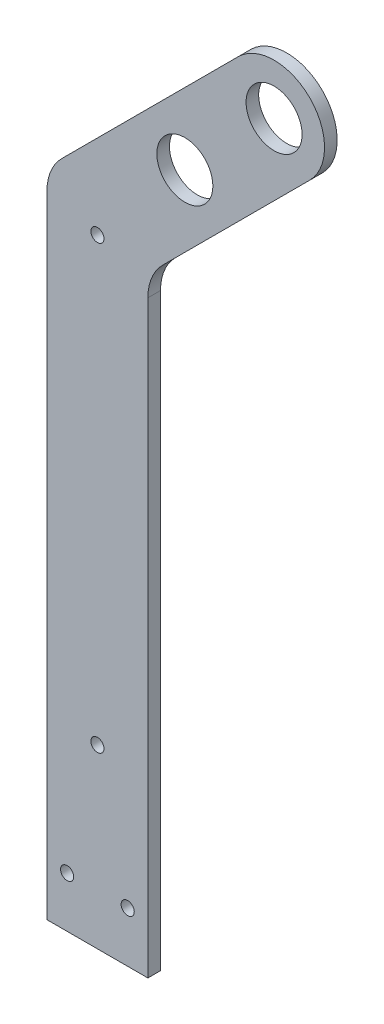
ISO-10303-21;
HEADER;
FILE_DESCRIPTION(('STEP AP214'),'2;1');
FILE_NAME('part.step','',(''),(''),'','','');
FILE_SCHEMA(('AUTOMOTIVE_DESIGN { 1 0 10303 214 1 1 1 1 }'));
ENDSEC;
DATA;
#1=APPLICATION_CONTEXT('core data for automotive mechanical design processes');
#2=APPLICATION_PROTOCOL_DEFINITION('international standard','automotive_design',2000,#1);
#3=PRODUCT_CONTEXT('',#1,'mechanical');
#4=PRODUCT('Part','Part','',(#3));
#5=PRODUCT_RELATED_PRODUCT_CATEGORY('part','',(#4));
#6=PRODUCT_DEFINITION_FORMATION('','',#4);
#7=PRODUCT_DEFINITION_CONTEXT('part definition',#1,'design');
#8=PRODUCT_DEFINITION('design','',#6,#7);
#9=PRODUCT_DEFINITION_SHAPE('','',#8);
#10=(LENGTH_UNIT() NAMED_UNIT(*) SI_UNIT(.MILLI.,.METRE.));
#11=(NAMED_UNIT(*) PLANE_ANGLE_UNIT() SI_UNIT($,.RADIAN.));
#12=(NAMED_UNIT(*) SI_UNIT($,.STERADIAN.) SOLID_ANGLE_UNIT());
#13=UNCERTAINTY_MEASURE_WITH_UNIT(LENGTH_MEASURE(1.E-05),#10,'distance_accuracy_value','');
#14=(GEOMETRIC_REPRESENTATION_CONTEXT(3) GLOBAL_UNCERTAINTY_ASSIGNED_CONTEXT((#13)) GLOBAL_UNIT_ASSIGNED_CONTEXT((#10,
#11,#12)) REPRESENTATION_CONTEXT('',''));
#15=CARTESIAN_POINT('',(0.,0.,0.));
#16=DIRECTION('',(0.,0.,1.));
#17=DIRECTION('',(1.,0.,0.));
#18=AXIS2_PLACEMENT_3D('',#15,#16,#17);
#19=CARTESIAN_POINT('',(-89.9999999999992,-320.,60.));
#20=DIRECTION('',(0.,1.,0.));
#21=DIRECTION('',(0.,0.,1.));
#22=AXIS2_PLACEMENT_3D('',#19,#20,#21);
#23=PLANE('',#22);
#24=DIRECTION('',(1.,0.,0.));
#25=VECTOR('',#24,1.);
#26=CARTESIAN_POINT('',(-89.9999999999992,-320.,5.));
#27=LINE('',#26,#25);
#28=CARTESIAN_POINT('',(-89.9999999999992,-320.,5.));
#29=VERTEX_POINT('',#28);
#30=CARTESIAN_POINT('',(-49.9999999999992,-320.,5.));
#31=VERTEX_POINT('',#30);
#32=EDGE_CURVE('E119',#29,#31,#27,.T.);
#33=ORIENTED_EDGE('',*,*,#32,.F.);
#34=DIRECTION('',(0.,0.,-1.));
#35=VECTOR('',#34,1.);
#36=CARTESIAN_POINT('',(-89.9999999999992,-320.,60.));
#37=LINE('',#36,#35);
#38=CARTESIAN_POINT('',(-89.9999999999992,-320.,0.));
#39=VERTEX_POINT('',#38);
#40=EDGE_CURVE('E130',#29,#39,#37,.T.);
#41=ORIENTED_EDGE('',*,*,#40,.T.);
#42=DIRECTION('',(1.,0.,0.));
#43=VECTOR('',#42,1.);
#44=CARTESIAN_POINT('',(-89.9999999999992,-320.,0.));
#45=LINE('',#44,#43);
#46=CARTESIAN_POINT('',(-49.9999999999992,-320.,0.));
#47=VERTEX_POINT('',#46);
#48=EDGE_CURVE('E221',#39,#47,#45,.T.);
#49=ORIENTED_EDGE('',*,*,#48,.T.);
#50=DIRECTION('',(0.,0.,-1.));
#51=VECTOR('',#50,1.);
#52=CARTESIAN_POINT('',(-49.9999999999992,-320.,60.));
#53=LINE('',#52,#51);
#54=EDGE_CURVE('E132',#31,#47,#53,.T.);
#55=ORIENTED_EDGE('',*,*,#54,.F.);
#56=EDGE_LOOP('',(#33,#41,#49,#55));
#57=FACE_BOUND('',#56,.T.);
#58=ADVANCED_FACE('F49',(#57),#23,.F.);
#59=CARTESIAN_POINT('',(-69.9999999999992,-70.,60.));
#60=DIRECTION('',(0.,0.,-1.));
#61=DIRECTION('',(-1.,0.,0.));
#62=AXIS2_PLACEMENT_3D('',#59,#60,#61);
#63=CYLINDRICAL_SURFACE('',#62,20.);
#64=DIRECTION('',(0.,0.,-1.));
#65=VECTOR('',#64,1.);
#66=CARTESIAN_POINT('',(-89.9999999999992,-70.,60.));
#67=LINE('',#66,#65);
#68=CARTESIAN_POINT('',(-89.9999999999992,-70.,5.));
#69=VERTEX_POINT('',#68);
#70=CARTESIAN_POINT('',(-89.9999999999992,-70.,0.));
#71=VERTEX_POINT('',#70);
#72=EDGE_CURVE('E154',#69,#71,#67,.T.);
#73=ORIENTED_EDGE('',*,*,#72,.F.);
#74=CARTESIAN_POINT('',(-69.9999999999992,-70.,5.));
#75=DIRECTION('',(0.,0.,1.));
#76=DIRECTION('',(1.,0.,0.));
#77=AXIS2_PLACEMENT_3D('',#74,#75,#76);
#78=CIRCLE('',#77,20.);
#79=CARTESIAN_POINT('',(-84.1421356237303,-55.8578643762691,5.));
#80=VERTEX_POINT('',#79);
#81=EDGE_CURVE('E121',#69,#80,#78,.F.);
#82=ORIENTED_EDGE('',*,*,#81,.T.);
#83=DIRECTION('',(0.,0.,-1.));
#84=VECTOR('',#83,1.);
#85=CARTESIAN_POINT('',(-84.1421356237303,-55.8578643762691,60.));
#86=LINE('',#85,#84);
#87=CARTESIAN_POINT('',(-84.1421356237303,-55.8578643762691,0.));
#88=VERTEX_POINT('',#87);
#89=EDGE_CURVE('E163',#88,#80,#86,.F.);
#90=ORIENTED_EDGE('',*,*,#89,.F.);
#91=CARTESIAN_POINT('',(-69.9999999999992,-70.,0.));
#92=DIRECTION('',(0.,0.,1.));
#93=DIRECTION('',(1.,0.,0.));
#94=AXIS2_PLACEMENT_3D('',#91,#92,#93);
#95=CIRCLE('',#94,20.);
#96=EDGE_CURVE('E161',#71,#88,#95,.F.);
#97=ORIENTED_EDGE('',*,*,#96,.F.);
#98=EDGE_LOOP('',(#73,#82,#90,#97));
#99=FACE_BOUND('',#98,.T.);
#100=ADVANCED_FACE('F248',(#99),#63,.T.);
#101=CARTESIAN_POINT('',(-35.3553390593274,-35.3553390593274,-40.));
#102=DIRECTION('',(0.,0.,1.));
#103=DIRECTION('',(1.,0.,0.));
#104=AXIS2_PLACEMENT_3D('',#101,#102,#103);
#105=CYLINDRICAL_SURFACE('',#104,11.1);
#106=CARTESIAN_POINT('',(-35.3553390593274,-35.3553390593274,0.));
#107=DIRECTION('',(0.,0.,1.));
#108=DIRECTION('',(1.,0.,0.));
#109=AXIS2_PLACEMENT_3D('',#106,#107,#108);
#110=CIRCLE('',#109,11.1);
#111=CARTESIAN_POINT('',(-24.2553390593274,-35.3553390593274,0.));
#112=VERTEX_POINT('',#111);
#113=EDGE_CURVE('E155',#112,#112,#110,.T.);
#114=ORIENTED_EDGE('',*,*,#113,.F.);
#115=EDGE_LOOP('',(#114));
#116=FACE_BOUND('',#115,.T.);
#117=CARTESIAN_POINT('',(-35.3553390593274,-35.3553390593274,5.));
#118=DIRECTION('',(0.,0.,1.));
#119=DIRECTION('',(1.,0.,0.));
#120=AXIS2_PLACEMENT_3D('',#117,#118,#119);
#121=CIRCLE('',#120,11.1);
#122=CARTESIAN_POINT('',(-24.2553390593274,-35.3553390593274,5.));
#123=VERTEX_POINT('',#122);
#124=EDGE_CURVE('E133',#123,#123,#121,.F.);
#125=ORIENTED_EDGE('',*,*,#124,.F.);
#126=EDGE_LOOP('',(#125));
#127=FACE_BOUND('',#126,.T.);
#128=ADVANCED_FACE('F253',(#116,#127),#105,.F.);
#129=CARTESIAN_POINT('',(-69.9999999999992,-250.,-5.));
#130=DIRECTION('',(0.,0.,1.));
#131=DIRECTION('',(1.,0.,0.));
#132=AXIS2_PLACEMENT_3D('',#129,#130,#131);
#133=CYLINDRICAL_SURFACE('',#132,2.6);
#134=CARTESIAN_POINT('',(-69.9999999999992,-250.,0.));
#135=DIRECTION('',(0.,0.,1.));
#136=DIRECTION('',(1.,0.,0.));
#137=AXIS2_PLACEMENT_3D('',#134,#135,#136);
#138=CIRCLE('',#137,2.6);
#139=CARTESIAN_POINT('',(-67.3999999999992,-250.,0.));
#140=VERTEX_POINT('',#139);
#141=EDGE_CURVE('E169',#140,#140,#138,.T.);
#142=ORIENTED_EDGE('',*,*,#141,.F.);
#143=EDGE_LOOP('',(#142));
#144=FACE_BOUND('',#143,.T.);
#145=CARTESIAN_POINT('',(-69.9999999999992,-250.,5.));
#146=DIRECTION('',(0.,0.,1.));
#147=DIRECTION('',(1.,0.,0.));
#148=AXIS2_PLACEMENT_3D('',#145,#146,#147);
#149=CIRCLE('',#148,2.6);
#150=CARTESIAN_POINT('',(-67.3999999999992,-250.,5.));
#151=VERTEX_POINT('',#150);
#152=EDGE_CURVE('E186',#151,#151,#149,.F.);
#153=ORIENTED_EDGE('',*,*,#152,.F.);
#154=EDGE_LOOP('',(#153));
#155=FACE_BOUND('',#154,.T.);
#156=ADVANCED_FACE('F181',(#144,#155),#133,.F.);
#157=CARTESIAN_POINT('',(-69.9999999999992,-75.,-5.));
#158=DIRECTION('',(0.,0.,1.));
#159=DIRECTION('',(1.,0.,0.));
#160=AXIS2_PLACEMENT_3D('',#157,#158,#159);
#161=CYLINDRICAL_SURFACE('',#160,2.6);
#162=CARTESIAN_POINT('',(-69.9999999999992,-75.,0.));
#163=DIRECTION('',(0.,0.,1.));
#164=DIRECTION('',(1.,0.,0.));
#165=AXIS2_PLACEMENT_3D('',#162,#163,#164);
#166=CIRCLE('',#165,2.6);
#167=CARTESIAN_POINT('',(-67.3999999999992,-75.,0.));
#168=VERTEX_POINT('',#167);
#169=EDGE_CURVE('E159',#168,#168,#166,.T.);
#170=ORIENTED_EDGE('',*,*,#169,.F.);
#171=EDGE_LOOP('',(#170));
#172=FACE_BOUND('',#171,.T.);
#173=CARTESIAN_POINT('',(-69.9999999999992,-75.,5.));
#174=DIRECTION('',(0.,0.,1.));
#175=DIRECTION('',(1.,0.,0.));
#176=AXIS2_PLACEMENT_3D('',#173,#174,#175);
#177=CIRCLE('',#176,2.6);
#178=CARTESIAN_POINT('',(-67.3999999999992,-75.,5.));
#179=VERTEX_POINT('',#178);
#180=EDGE_CURVE('E53',#179,#179,#177,.F.);
#181=ORIENTED_EDGE('',*,*,#180,.F.);
#182=EDGE_LOOP('',(#181));
#183=FACE_BOUND('',#182,.T.);
#184=ADVANCED_FACE('F178',(#172,#183),#161,.F.);
#185=CARTESIAN_POINT('',(0.,0.,0.));
#186=DIRECTION('',(0.,0.,1.));
#187=DIRECTION('',(1.,0.,0.));
#188=AXIS2_PLACEMENT_3D('',#185,#186,#187);
#189=PLANE('',#188);
#190=ORIENTED_EDGE('',*,*,#169,.T.);
#191=EDGE_LOOP('',(#190));
#192=FACE_BOUND('',#191,.T.);
#193=ORIENTED_EDGE('',*,*,#141,.T.);
#194=EDGE_LOOP('',(#193));
#195=FACE_BOUND('',#194,.T.);
#196=ORIENTED_EDGE('',*,*,#113,.T.);
#197=EDGE_LOOP('',(#196));
#198=FACE_BOUND('',#197,.T.);
#199=DIRECTION('',(0.,-1.,0.));
#200=VECTOR('',#199,1.);
#201=CARTESIAN_POINT('',(-89.9999999999992,-61.7157287525382,0.));
#202=LINE('',#201,#200);
#203=EDGE_CURVE('E138',#71,#39,#202,.T.);
#204=ORIENTED_EDGE('',*,*,#203,.F.);
#205=ORIENTED_EDGE('',*,*,#96,.T.);
#206=DIRECTION('',(-0.707106781186544,-0.707106781186551,0.));
#207=VECTOR('',#206,1.);
#208=CARTESIAN_POINT('',(-14.142135623731,14.1421356237309,0.));
#209=LINE('',#208,#207);
#210=CARTESIAN_POINT('',(-14.142135623731,14.1421356237309,0.));
#211=VERTEX_POINT('',#210);
#212=EDGE_CURVE('E144',#211,#88,#209,.T.);
#213=ORIENTED_EDGE('',*,*,#212,.F.);
#214=CARTESIAN_POINT('',(0.,0.,0.));
#215=DIRECTION('',(0.,0.,1.));
#216=DIRECTION('',(1.,0.,0.));
#217=AXIS2_PLACEMENT_3D('',#214,#215,#216);
#218=CIRCLE('',#217,20.);
#219=CARTESIAN_POINT('',(14.142135623731,-14.1421356237309,0.));
#220=VERTEX_POINT('',#219);
#221=EDGE_CURVE('E151',#220,#211,#218,.T.);
#222=ORIENTED_EDGE('',*,*,#221,.F.);
#223=DIRECTION('',(-0.707106781186544,-0.707106781186551,0.));
#224=VECTOR('',#223,1.);
#225=CARTESIAN_POINT('',(14.142135623731,-14.1421356237309,0.));
#226=LINE('',#225,#224);
#227=CARTESIAN_POINT('',(-44.1421356237302,-72.4264068711928,0.));
#228=VERTEX_POINT('',#227);
#229=EDGE_CURVE('E158',#220,#228,#226,.T.);
#230=ORIENTED_EDGE('',*,*,#229,.T.);
#231=CARTESIAN_POINT('',(-29.9999999999992,-86.5685424949237,0.));
#232=DIRECTION('',(0.,0.,1.));
#233=DIRECTION('',(1.,0.,0.));
#234=AXIS2_PLACEMENT_3D('',#231,#232,#233);
#235=CIRCLE('',#234,20.);
#236=CARTESIAN_POINT('',(-49.9999999999992,-86.5685424949237,0.));
#237=VERTEX_POINT('',#236);
#238=EDGE_CURVE('E12',#228,#237,#235,.T.);
#239=ORIENTED_EDGE('',*,*,#238,.T.);
#240=DIRECTION('',(0.,-1.,0.));
#241=VECTOR('',#240,1.);
#242=CARTESIAN_POINT('',(-49.9999999999992,-78.2842712474618,0.));
#243=LINE('',#242,#241);
#244=EDGE_CURVE('E219',#237,#47,#243,.T.);
#245=ORIENTED_EDGE('',*,*,#244,.T.);
#246=ORIENTED_EDGE('',*,*,#48,.F.);
#247=EDGE_LOOP('',(#204,#205,#213,#222,#230,#239,#245,#246));
#248=FACE_BOUND('',#247,.T.);
#249=CARTESIAN_POINT('',(0.,0.,0.));
#250=DIRECTION('',(0.,0.,1.));
#251=DIRECTION('',(1.,0.,0.));
#252=AXIS2_PLACEMENT_3D('',#249,#250,#251);
#253=CIRCLE('',#252,11.1);
#254=CARTESIAN_POINT('',(11.1,0.,0.));
#255=VERTEX_POINT('',#254);
#256=EDGE_CURVE('E148',#255,#255,#253,.T.);
#257=ORIENTED_EDGE('',*,*,#256,.T.);
#258=EDGE_LOOP('',(#257));
#259=FACE_BOUND('',#258,.T.);
#260=CARTESIAN_POINT('',(-57.9999999999992,-300.,0.));
#261=DIRECTION('',(0.,0.,1.));
#262=DIRECTION('',(1.,0.,0.));
#263=AXIS2_PLACEMENT_3D('',#260,#261,#262);
#264=CIRCLE('',#263,2.59999999999999);
#265=CARTESIAN_POINT('',(-55.3999999999992,-300.,0.));
#266=VERTEX_POINT('',#265);
#267=EDGE_CURVE('E212',#266,#266,#264,.F.);
#268=ORIENTED_EDGE('',*,*,#267,.F.);
#269=EDGE_LOOP('',(#268));
#270=FACE_BOUND('',#269,.T.);
#271=CARTESIAN_POINT('',(-81.9999999999992,-300.,0.));
#272=DIRECTION('',(0.,0.,1.));
#273=DIRECTION('',(1.,0.,0.));
#274=AXIS2_PLACEMENT_3D('',#271,#272,#273);
#275=CIRCLE('',#274,2.6);
#276=CARTESIAN_POINT('',(-79.3999999999992,-300.,0.));
#277=VERTEX_POINT('',#276);
#278=EDGE_CURVE('E171',#277,#277,#275,.F.);
#279=ORIENTED_EDGE('',*,*,#278,.F.);
#280=EDGE_LOOP('',(#279));
#281=FACE_BOUND('',#280,.T.);
#282=ADVANCED_FACE('F175',(#192,#195,#198,#248,#259,#270,#281),#189,.F.);
#283=CARTESIAN_POINT('',(-89.9999999999992,-61.7157287525382,60.));
#284=DIRECTION('',(1.,0.,0.));
#285=DIRECTION('',(0.,1.,0.));
#286=AXIS2_PLACEMENT_3D('',#283,#284,#285);
#287=PLANE('',#286);
#288=ORIENTED_EDGE('',*,*,#203,.T.);
#289=ORIENTED_EDGE('',*,*,#40,.F.);
#290=DIRECTION('',(0.,1.,0.));
#291=VECTOR('',#290,1.);
#292=CARTESIAN_POINT('',(-89.9999999999992,-370.,5.));
#293=LINE('',#292,#291);
#294=EDGE_CURVE('E115',#29,#69,#293,.T.);
#295=ORIENTED_EDGE('',*,*,#294,.T.);
#296=ORIENTED_EDGE('',*,*,#72,.T.);
#297=EDGE_LOOP('',(#288,#289,#295,#296));
#298=FACE_BOUND('',#297,.T.);
#299=ADVANCED_FACE('F136',(#298),#287,.F.);
#300=CARTESIAN_POINT('',(-14.142135623731,14.1421356237309,60.));
#301=DIRECTION('',(0.707106781186551,-0.707106781186544,0.));
#302=DIRECTION('',(0.707106781186544,0.707106781186551,0.));
#303=AXIS2_PLACEMENT_3D('',#300,#301,#302);
#304=PLANE('',#303);
#305=DIRECTION('',(-0.707106781186544,-0.707106781186551,0.));
#306=VECTOR('',#305,1.);
#307=CARTESIAN_POINT('',(-14.142135623731,14.1421356237309,5.));
#308=LINE('',#307,#306);
#309=CARTESIAN_POINT('',(-14.142135623731,14.1421356237309,5.));
#310=VERTEX_POINT('',#309);
#311=EDGE_CURVE('E66',#310,#80,#308,.T.);
#312=ORIENTED_EDGE('',*,*,#311,.F.);
#313=DIRECTION('',(0.,0.,-1.));
#314=VECTOR('',#313,1.);
#315=CARTESIAN_POINT('',(-14.142135623731,14.1421356237309,60.));
#316=LINE('',#315,#314);
#317=EDGE_CURVE('E140',#310,#211,#316,.T.);
#318=ORIENTED_EDGE('',*,*,#317,.T.);
#319=ORIENTED_EDGE('',*,*,#212,.T.);
#320=ORIENTED_EDGE('',*,*,#89,.T.);
#321=EDGE_LOOP('',(#312,#318,#319,#320));
#322=FACE_BOUND('',#321,.T.);
#323=ADVANCED_FACE('F269',(#322),#304,.F.);
#324=CARTESIAN_POINT('',(0.,0.,60.));
#325=DIRECTION('',(0.,0.,-1.));
#326=DIRECTION('',(-1.,0.,0.));
#327=AXIS2_PLACEMENT_3D('',#324,#325,#326);
#328=CYLINDRICAL_SURFACE('',#327,11.1);
#329=ORIENTED_EDGE('',*,*,#256,.F.);
#330=EDGE_LOOP('',(#329));
#331=FACE_BOUND('',#330,.T.);
#332=CARTESIAN_POINT('',(0.,0.,5.));
#333=DIRECTION('',(0.,0.,1.));
#334=DIRECTION('',(1.,0.,0.));
#335=AXIS2_PLACEMENT_3D('',#332,#333,#334);
#336=CIRCLE('',#335,11.1);
#337=CARTESIAN_POINT('',(11.1,0.,5.));
#338=VERTEX_POINT('',#337);
#339=EDGE_CURVE('E209',#338,#338,#336,.T.);
#340=ORIENTED_EDGE('',*,*,#339,.T.);
#341=EDGE_LOOP('',(#340));
#342=FACE_BOUND('',#341,.T.);
#343=ADVANCED_FACE('F243',(#331,#342),#328,.F.);
#344=CARTESIAN_POINT('',(-29.9999999999992,-86.5685424949237,60.));
#345=DIRECTION('',(0.,0.,1.));
#346=DIRECTION('',(1.,0.,0.));
#347=AXIS2_PLACEMENT_3D('',#344,#345,#346);
#348=CYLINDRICAL_SURFACE('',#347,20.);
#349=CARTESIAN_POINT('',(-29.9999999999992,-86.5685424949237,5.));
#350=DIRECTION('',(0.,0.,1.));
#351=DIRECTION('',(1.,0.,0.));
#352=AXIS2_PLACEMENT_3D('',#349,#350,#351);
#353=CIRCLE('',#352,20.);
#354=CARTESIAN_POINT('',(-49.9999999999992,-86.5685424949237,5.));
#355=VERTEX_POINT('',#354);
#356=CARTESIAN_POINT('',(-44.1421356237302,-72.4264068711928,5.));
#357=VERTEX_POINT('',#356);
#358=EDGE_CURVE('E204',#355,#357,#353,.F.);
#359=ORIENTED_EDGE('',*,*,#358,.F.);
#360=DIRECTION('',(0.,0.,-1.));
#361=VECTOR('',#360,1.);
#362=CARTESIAN_POINT('',(-49.9999999999992,-86.5685424949237,60.));
#363=LINE('',#362,#361);
#364=EDGE_CURVE('E58',#237,#355,#363,.F.);
#365=ORIENTED_EDGE('',*,*,#364,.F.);
#366=ORIENTED_EDGE('',*,*,#238,.F.);
#367=DIRECTION('',(0.,0.,-1.));
#368=VECTOR('',#367,1.);
#369=CARTESIAN_POINT('',(-44.1421356237302,-72.4264068711928,0.));
#370=LINE('',#369,#368);
#371=EDGE_CURVE('E74',#357,#228,#370,.T.);
#372=ORIENTED_EDGE('',*,*,#371,.F.);
#373=EDGE_LOOP('',(#359,#365,#366,#372));
#374=FACE_BOUND('',#373,.T.);
#375=ADVANCED_FACE('F51',(#374),#348,.F.);
#376=CARTESIAN_POINT('',(14.142135623731,-14.1421356237309,60.));
#377=DIRECTION('',(0.707106781186551,-0.707106781186544,0.));
#378=DIRECTION('',(0.707106781186544,0.707106781186551,0.));
#379=AXIS2_PLACEMENT_3D('',#376,#377,#378);
#380=PLANE('',#379);
#381=DIRECTION('',(0.,0.,-1.));
#382=VECTOR('',#381,1.);
#383=CARTESIAN_POINT('',(14.142135623731,-14.1421356237309,60.));
#384=LINE('',#383,#382);
#385=CARTESIAN_POINT('',(14.142135623731,-14.1421356237309,5.));
#386=VERTEX_POINT('',#385);
#387=EDGE_CURVE('E142',#386,#220,#384,.T.);
#388=ORIENTED_EDGE('',*,*,#387,.F.);
#389=DIRECTION('',(-0.707106781186544,-0.707106781186551,0.));
#390=VECTOR('',#389,1.);
#391=CARTESIAN_POINT('',(14.142135623731,-14.1421356237309,5.));
#392=LINE('',#391,#390);
#393=EDGE_CURVE('E202',#386,#357,#392,.T.);
#394=ORIENTED_EDGE('',*,*,#393,.T.);
#395=ORIENTED_EDGE('',*,*,#371,.T.);
#396=ORIENTED_EDGE('',*,*,#229,.F.);
#397=EDGE_LOOP('',(#388,#394,#395,#396));
#398=FACE_BOUND('',#397,.T.);
#399=ADVANCED_FACE('F234',(#398),#380,.T.);
#400=CARTESIAN_POINT('',(0.,0.,60.));
#401=DIRECTION('',(0.,0.,-1.));
#402=DIRECTION('',(-1.,0.,0.));
#403=AXIS2_PLACEMENT_3D('',#400,#401,#402);
#404=CYLINDRICAL_SURFACE('',#403,20.);
#405=CARTESIAN_POINT('',(0.,0.,5.));
#406=DIRECTION('',(0.,0.,1.));
#407=DIRECTION('',(1.,0.,0.));
#408=AXIS2_PLACEMENT_3D('',#405,#406,#407);
#409=CIRCLE('',#408,20.);
#410=EDGE_CURVE('E200',#386,#310,#409,.T.);
#411=ORIENTED_EDGE('',*,*,#410,.F.);
#412=ORIENTED_EDGE('',*,*,#387,.T.);
#413=ORIENTED_EDGE('',*,*,#221,.T.);
#414=ORIENTED_EDGE('',*,*,#317,.F.);
#415=EDGE_LOOP('',(#411,#412,#413,#414));
#416=FACE_BOUND('',#415,.T.);
#417=ADVANCED_FACE('F229',(#416),#404,.T.);
#418=CARTESIAN_POINT('',(-49.9999999999992,-78.2842712474618,60.));
#419=DIRECTION('',(1.,0.,0.));
#420=DIRECTION('',(0.,1.,0.));
#421=AXIS2_PLACEMENT_3D('',#418,#419,#420);
#422=PLANE('',#421);
#423=ORIENTED_EDGE('',*,*,#54,.T.);
#424=ORIENTED_EDGE('',*,*,#244,.F.);
#425=ORIENTED_EDGE('',*,*,#364,.T.);
#426=DIRECTION('',(0.,-1.,0.));
#427=VECTOR('',#426,1.);
#428=CARTESIAN_POINT('',(-49.9999999999992,-78.2842712474618,5.));
#429=LINE('',#428,#427);
#430=EDGE_CURVE('E134',#355,#31,#429,.T.);
#431=ORIENTED_EDGE('',*,*,#430,.T.);
#432=EDGE_LOOP('',(#423,#424,#425,#431));
#433=FACE_BOUND('',#432,.T.);
#434=ADVANCED_FACE('F241',(#433),#422,.T.);
#435=CARTESIAN_POINT('',(66.2918686176202,-370.,5.));
#436=DIRECTION('',(0.,0.,1.));
#437=DIRECTION('',(1.,0.,0.));
#438=AXIS2_PLACEMENT_3D('',#435,#436,#437);
#439=PLANE('',#438);
#440=ORIENTED_EDGE('',*,*,#339,.F.);
#441=EDGE_LOOP('',(#440));
#442=FACE_BOUND('',#441,.T.);
#443=CARTESIAN_POINT('',(-81.9999999999992,-300.,5.));
#444=DIRECTION('',(0.,0.,1.));
#445=DIRECTION('',(1.,0.,0.));
#446=AXIS2_PLACEMENT_3D('',#443,#444,#445);
#447=CIRCLE('',#446,2.6);
#448=CARTESIAN_POINT('',(-79.3999999999992,-300.,5.));
#449=VERTEX_POINT('',#448);
#450=EDGE_CURVE('E193',#449,#449,#447,.F.);
#451=ORIENTED_EDGE('',*,*,#450,.T.);
#452=EDGE_LOOP('',(#451));
#453=FACE_BOUND('',#452,.T.);
#454=CARTESIAN_POINT('',(-57.9999999999992,-300.,5.));
#455=DIRECTION('',(0.,0.,1.));
#456=DIRECTION('',(1.,0.,0.));
#457=AXIS2_PLACEMENT_3D('',#454,#455,#456);
#458=CIRCLE('',#457,2.59999999999999);
#459=CARTESIAN_POINT('',(-55.3999999999992,-300.,5.));
#460=VERTEX_POINT('',#459);
#461=EDGE_CURVE('E188',#460,#460,#458,.F.);
#462=ORIENTED_EDGE('',*,*,#461,.T.);
#463=EDGE_LOOP('',(#462));
#464=FACE_BOUND('',#463,.T.);
#465=ORIENTED_EDGE('',*,*,#152,.T.);
#466=EDGE_LOOP('',(#465));
#467=FACE_BOUND('',#466,.T.);
#468=ORIENTED_EDGE('',*,*,#180,.T.);
#469=EDGE_LOOP('',(#468));
#470=FACE_BOUND('',#469,.T.);
#471=ORIENTED_EDGE('',*,*,#32,.T.);
#472=ORIENTED_EDGE('',*,*,#430,.F.);
#473=ORIENTED_EDGE('',*,*,#358,.T.);
#474=ORIENTED_EDGE('',*,*,#393,.F.);
#475=ORIENTED_EDGE('',*,*,#410,.T.);
#476=ORIENTED_EDGE('',*,*,#311,.T.);
#477=ORIENTED_EDGE('',*,*,#81,.F.);
#478=ORIENTED_EDGE('',*,*,#294,.F.);
#479=EDGE_LOOP('',(#471,#472,#473,#474,#475,#476,#477,#478));
#480=FACE_BOUND('',#479,.T.);
#481=ORIENTED_EDGE('',*,*,#124,.T.);
#482=EDGE_LOOP('',(#481));
#483=FACE_BOUND('',#482,.T.);
#484=ADVANCED_FACE('F117',(#442,#453,#464,#467,#470,#480,#483),#439,.T.);
#485=CARTESIAN_POINT('',(-57.9999999999992,-300.,-5.));
#486=DIRECTION('',(0.,0.,1.));
#487=DIRECTION('',(1.,0.,0.));
#488=AXIS2_PLACEMENT_3D('',#485,#486,#487);
#489=CYLINDRICAL_SURFACE('',#488,2.59999999999999);
#490=ORIENTED_EDGE('',*,*,#267,.T.);
#491=EDGE_LOOP('',(#490));
#492=FACE_BOUND('',#491,.T.);
#493=ORIENTED_EDGE('',*,*,#461,.F.);
#494=EDGE_LOOP('',(#493));
#495=FACE_BOUND('',#494,.T.);
#496=ADVANCED_FACE('F262',(#492,#495),#489,.F.);
#497=CARTESIAN_POINT('',(-81.9999999999992,-300.,-5.));
#498=DIRECTION('',(0.,0.,1.));
#499=DIRECTION('',(1.,0.,0.));
#500=AXIS2_PLACEMENT_3D('',#497,#498,#499);
#501=CYLINDRICAL_SURFACE('',#500,2.6);
#502=ORIENTED_EDGE('',*,*,#278,.T.);
#503=EDGE_LOOP('',(#502));
#504=FACE_BOUND('',#503,.T.);
#505=ORIENTED_EDGE('',*,*,#450,.F.);
#506=EDGE_LOOP('',(#505));
#507=FACE_BOUND('',#506,.T.);
#508=ADVANCED_FACE('F282',(#504,#507),#501,.F.);
#509=CLOSED_SHELL('',(#58,#100,#128,#156,#184,#282,#299,#323,#343,#375,#399,#417,#434,#484,#496,#508));
#510=MANIFOLD_SOLID_BREP('B2',#509);
#511=ADVANCED_BREP_SHAPE_REPRESENTATION('',(#18,#510),#14);
#512=SHAPE_DEFINITION_REPRESENTATION(#9,#511);
ENDSEC;
END-ISO-10303-21;
